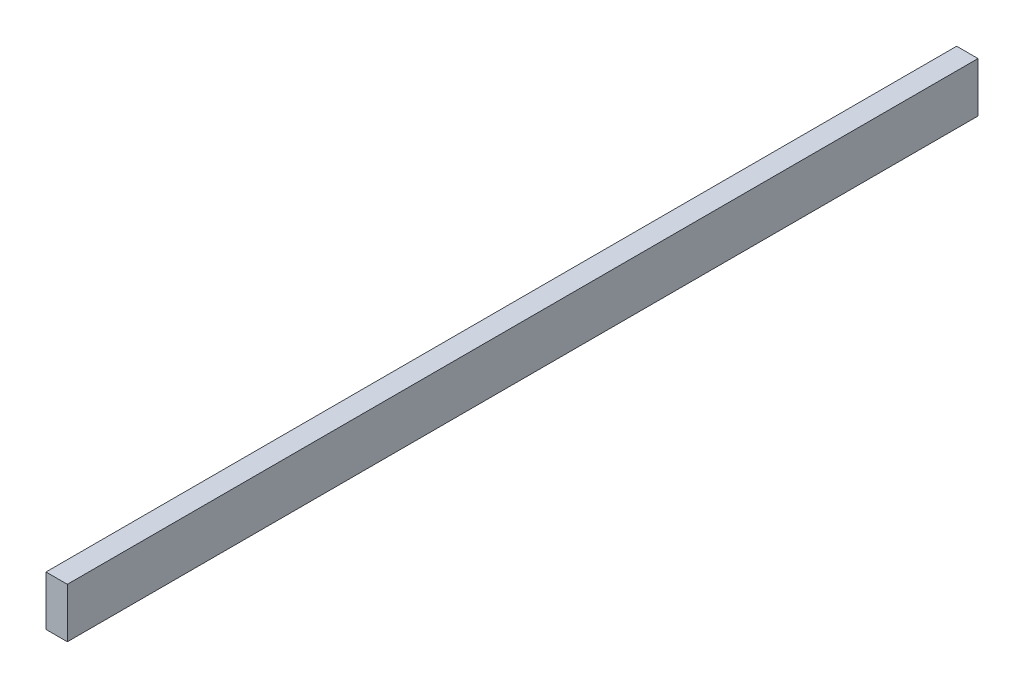
ISO-10303-21;
HEADER;
FILE_DESCRIPTION(('STEP AP214'),'2;1');
FILE_NAME('part.step','',(''),(''),'','','');
FILE_SCHEMA(('AUTOMOTIVE_DESIGN { 1 0 10303 214 1 1 1 1 }'));
ENDSEC;
DATA;
#1=APPLICATION_CONTEXT('core data for automotive mechanical design processes');
#2=APPLICATION_PROTOCOL_DEFINITION('international standard','automotive_design',2000,#1);
#3=PRODUCT_CONTEXT('',#1,'mechanical');
#4=PRODUCT('Part','Part','',(#3));
#5=PRODUCT_RELATED_PRODUCT_CATEGORY('part','',(#4));
#6=PRODUCT_DEFINITION_FORMATION('','',#4);
#7=PRODUCT_DEFINITION_CONTEXT('part definition',#1,'design');
#8=PRODUCT_DEFINITION('design','',#6,#7);
#9=PRODUCT_DEFINITION_SHAPE('','',#8);
#10=(LENGTH_UNIT() NAMED_UNIT(*) SI_UNIT(.MILLI.,.METRE.));
#11=(NAMED_UNIT(*) PLANE_ANGLE_UNIT() SI_UNIT($,.RADIAN.));
#12=(NAMED_UNIT(*) SI_UNIT($,.STERADIAN.) SOLID_ANGLE_UNIT());
#13=UNCERTAINTY_MEASURE_WITH_UNIT(LENGTH_MEASURE(1.E-05),#10,'distance_accuracy_value','');
#14=(GEOMETRIC_REPRESENTATION_CONTEXT(3) GLOBAL_UNCERTAINTY_ASSIGNED_CONTEXT((#13)) GLOBAL_UNIT_ASSIGNED_CONTEXT((#10,
#11,#12)) REPRESENTATION_CONTEXT('',''));
#15=CARTESIAN_POINT('',(0.,0.,0.));
#16=DIRECTION('',(0.,0.,1.));
#17=DIRECTION('',(1.,0.,0.));
#18=AXIS2_PLACEMENT_3D('',#15,#16,#17);
#19=CARTESIAN_POINT('',(38.1,-44.45,-812.8));
#20=DIRECTION('',(0.,0.,1.));
#21=DIRECTION('',(1.,0.,0.));
#22=AXIS2_PLACEMENT_3D('',#19,#20,#21);
#23=PLANE('',#22);
#24=DIRECTION('',(0.,1.,0.));
#25=VECTOR('',#24,1.);
#26=CARTESIAN_POINT('',(0.,-44.45,-812.8));
#27=LINE('',#26,#25);
#28=CARTESIAN_POINT('',(0.,-44.45,-812.8));
#29=VERTEX_POINT('',#28);
#30=CARTESIAN_POINT('',(0.,44.45,-812.8));
#31=VERTEX_POINT('',#30);
#32=EDGE_CURVE('E97',#29,#31,#27,.T.);
#33=ORIENTED_EDGE('',*,*,#32,.T.);
#34=DIRECTION('',(-1.,0.,0.));
#35=VECTOR('',#34,1.);
#36=CARTESIAN_POINT('',(38.1,44.45,-812.8));
#37=LINE('',#36,#35);
#38=CARTESIAN_POINT('',(38.1,44.45,-812.8));
#39=VERTEX_POINT('',#38);
#40=EDGE_CURVE('E11',#39,#31,#37,.T.);
#41=ORIENTED_EDGE('',*,*,#40,.F.);
#42=DIRECTION('',(0.,1.,0.));
#43=VECTOR('',#42,1.);
#44=CARTESIAN_POINT('',(38.1,-44.45,-812.8));
#45=LINE('',#44,#43);
#46=CARTESIAN_POINT('',(38.1,-44.45,-812.8));
#47=VERTEX_POINT('',#46);
#48=EDGE_CURVE('E85',#47,#39,#45,.T.);
#49=ORIENTED_EDGE('',*,*,#48,.F.);
#50=DIRECTION('',(-1.,0.,0.));
#51=VECTOR('',#50,1.);
#52=CARTESIAN_POINT('',(38.1,-44.45,-812.8));
#53=LINE('',#52,#51);
#54=EDGE_CURVE('E93',#47,#29,#53,.T.);
#55=ORIENTED_EDGE('',*,*,#54,.T.);
#56=EDGE_LOOP('',(#33,#41,#49,#55));
#57=FACE_BOUND('',#56,.T.);
#58=ADVANCED_FACE('F34',(#57),#23,.F.);
#59=CARTESIAN_POINT('',(38.1,44.45,812.8));
#60=DIRECTION('',(0.,-1.,0.));
#61=DIRECTION('',(0.,0.,-1.));
#62=AXIS2_PLACEMENT_3D('',#59,#60,#61);
#63=PLANE('',#62);
#64=DIRECTION('',(0.,0.,1.));
#65=VECTOR('',#64,1.);
#66=CARTESIAN_POINT('',(0.,44.45,812.8));
#67=LINE('',#66,#65);
#68=CARTESIAN_POINT('',(0.,44.45,812.8));
#69=VERTEX_POINT('',#68);
#70=EDGE_CURVE('E89',#31,#69,#67,.T.);
#71=ORIENTED_EDGE('',*,*,#70,.T.);
#72=DIRECTION('',(-1.,0.,0.));
#73=VECTOR('',#72,1.);
#74=CARTESIAN_POINT('',(38.1,44.45,812.8));
#75=LINE('',#74,#73);
#76=CARTESIAN_POINT('',(38.1,44.45,812.8));
#77=VERTEX_POINT('',#76);
#78=EDGE_CURVE('E42',#77,#69,#75,.T.);
#79=ORIENTED_EDGE('',*,*,#78,.F.);
#80=DIRECTION('',(0.,0.,1.));
#81=VECTOR('',#80,1.);
#82=CARTESIAN_POINT('',(38.1,44.45,812.8));
#83=LINE('',#82,#81);
#84=EDGE_CURVE('E80',#39,#77,#83,.T.);
#85=ORIENTED_EDGE('',*,*,#84,.F.);
#86=ORIENTED_EDGE('',*,*,#40,.T.);
#87=EDGE_LOOP('',(#71,#79,#85,#86));
#88=FACE_BOUND('',#87,.T.);
#89=ADVANCED_FACE('F88',(#88),#63,.F.);
#90=CARTESIAN_POINT('',(38.1,-44.45,812.8));
#91=DIRECTION('',(0.,0.,-1.));
#92=DIRECTION('',(-1.,0.,0.));
#93=AXIS2_PLACEMENT_3D('',#90,#91,#92);
#94=PLANE('',#93);
#95=DIRECTION('',(0.,-1.,0.));
#96=VECTOR('',#95,1.);
#97=CARTESIAN_POINT('',(0.,-44.45,812.8));
#98=LINE('',#97,#96);
#99=CARTESIAN_POINT('',(0.,-44.45,812.8));
#100=VERTEX_POINT('',#99);
#101=EDGE_CURVE('E67',#69,#100,#98,.T.);
#102=ORIENTED_EDGE('',*,*,#101,.T.);
#103=DIRECTION('',(-1.,0.,0.));
#104=VECTOR('',#103,1.);
#105=CARTESIAN_POINT('',(38.1,-44.45,812.8));
#106=LINE('',#105,#104);
#107=CARTESIAN_POINT('',(38.1,-44.45,812.8));
#108=VERTEX_POINT('',#107);
#109=EDGE_CURVE('E90',#108,#100,#106,.T.);
#110=ORIENTED_EDGE('',*,*,#109,.F.);
#111=DIRECTION('',(0.,-1.,0.));
#112=VECTOR('',#111,1.);
#113=CARTESIAN_POINT('',(38.1,-44.45,812.8));
#114=LINE('',#113,#112);
#115=EDGE_CURVE('E83',#77,#108,#114,.T.);
#116=ORIENTED_EDGE('',*,*,#115,.F.);
#117=ORIENTED_EDGE('',*,*,#78,.T.);
#118=EDGE_LOOP('',(#102,#110,#116,#117));
#119=FACE_BOUND('',#118,.T.);
#120=ADVANCED_FACE('F91',(#119),#94,.F.);
#121=CARTESIAN_POINT('',(38.1,-44.45,812.8));
#122=DIRECTION('',(0.,1.,0.));
#123=DIRECTION('',(0.,0.,1.));
#124=AXIS2_PLACEMENT_3D('',#121,#122,#123);
#125=PLANE('',#124);
#126=DIRECTION('',(0.,0.,-1.));
#127=VECTOR('',#126,1.);
#128=CARTESIAN_POINT('',(0.,-44.45,812.8));
#129=LINE('',#128,#127);
#130=EDGE_CURVE('E73',#100,#29,#129,.T.);
#131=ORIENTED_EDGE('',*,*,#130,.T.);
#132=ORIENTED_EDGE('',*,*,#54,.F.);
#133=DIRECTION('',(0.,0.,-1.));
#134=VECTOR('',#133,1.);
#135=CARTESIAN_POINT('',(38.1,-44.45,812.8));
#136=LINE('',#135,#134);
#137=EDGE_CURVE('E50',#108,#47,#136,.T.);
#138=ORIENTED_EDGE('',*,*,#137,.F.);
#139=ORIENTED_EDGE('',*,*,#109,.T.);
#140=EDGE_LOOP('',(#131,#132,#138,#139));
#141=FACE_BOUND('',#140,.T.);
#142=ADVANCED_FACE('F104',(#141),#125,.F.);
#143=CARTESIAN_POINT('',(38.1,0.,0.));
#144=DIRECTION('',(-1.,0.,0.));
#145=DIRECTION('',(0.,0.,1.));
#146=AXIS2_PLACEMENT_3D('',#143,#144,#145);
#147=PLANE('',#146);
#148=ORIENTED_EDGE('',*,*,#48,.T.);
#149=ORIENTED_EDGE('',*,*,#84,.T.);
#150=ORIENTED_EDGE('',*,*,#115,.T.);
#151=ORIENTED_EDGE('',*,*,#137,.T.);
#152=EDGE_LOOP('',(#148,#149,#150,#151));
#153=FACE_BOUND('',#152,.T.);
#154=ADVANCED_FACE('F81',(#153),#147,.F.);
#155=CARTESIAN_POINT('',(0.,0.,0.));
#156=DIRECTION('',(-1.,0.,0.));
#157=DIRECTION('',(0.,0.,1.));
#158=AXIS2_PLACEMENT_3D('',#155,#156,#157);
#159=PLANE('',#158);
#160=ORIENTED_EDGE('',*,*,#32,.F.);
#161=ORIENTED_EDGE('',*,*,#130,.F.);
#162=ORIENTED_EDGE('',*,*,#101,.F.);
#163=ORIENTED_EDGE('',*,*,#70,.F.);
#164=EDGE_LOOP('',(#160,#161,#162,#163));
#165=FACE_BOUND('',#164,.T.);
#166=ADVANCED_FACE('F107',(#165),#159,.T.);
#167=CLOSED_SHELL('',(#58,#89,#120,#142,#154,#166));
#168=MANIFOLD_SOLID_BREP('B2',#167);
#169=ADVANCED_BREP_SHAPE_REPRESENTATION('',(#18,#168),#14);
#170=SHAPE_DEFINITION_REPRESENTATION(#9,#169);
ENDSEC;
END-ISO-10303-21;
